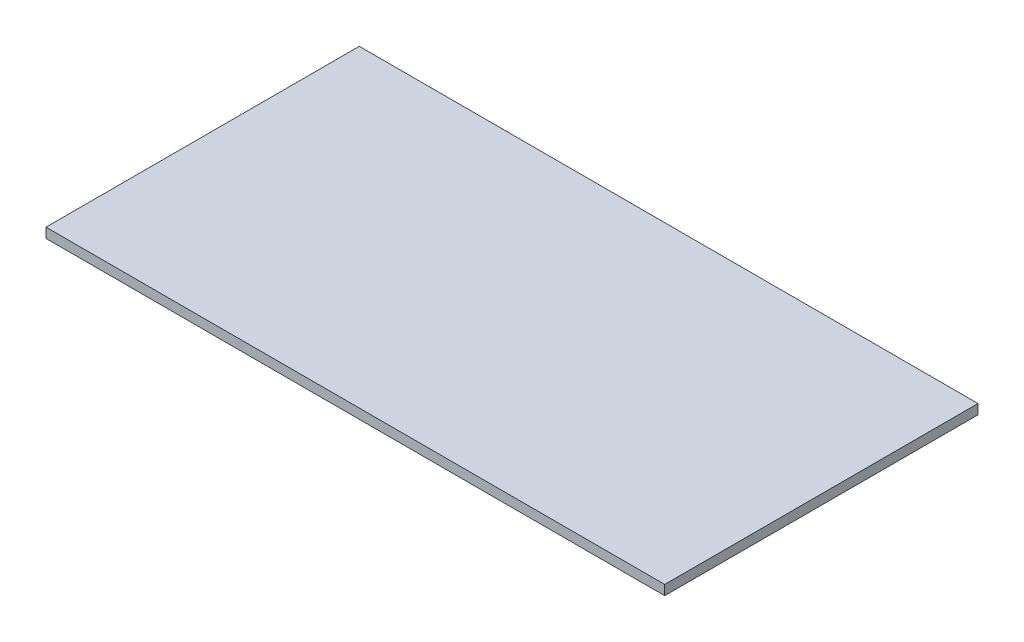
ISO-10303-21;
HEADER;
FILE_DESCRIPTION(('STEP AP214'),'2;1');
FILE_NAME('part.step','',(''),(''),'','','');
FILE_SCHEMA(('AUTOMOTIVE_DESIGN { 1 0 10303 214 1 1 1 1 }'));
ENDSEC;
DATA;
#1=APPLICATION_CONTEXT('core data for automotive mechanical design processes');
#2=APPLICATION_PROTOCOL_DEFINITION('international standard','automotive_design',2000,#1);
#3=PRODUCT_CONTEXT('',#1,'mechanical');
#4=PRODUCT('Part','Part','',(#3));
#5=PRODUCT_RELATED_PRODUCT_CATEGORY('part','',(#4));
#6=PRODUCT_DEFINITION_FORMATION('','',#4);
#7=PRODUCT_DEFINITION_CONTEXT('part definition',#1,'design');
#8=PRODUCT_DEFINITION('design','',#6,#7);
#9=PRODUCT_DEFINITION_SHAPE('','',#8);
#10=(LENGTH_UNIT() NAMED_UNIT(*) SI_UNIT(.MILLI.,.METRE.));
#11=(NAMED_UNIT(*) PLANE_ANGLE_UNIT() SI_UNIT($,.RADIAN.));
#12=(NAMED_UNIT(*) SI_UNIT($,.STERADIAN.) SOLID_ANGLE_UNIT());
#13=UNCERTAINTY_MEASURE_WITH_UNIT(LENGTH_MEASURE(1.E-05),#10,'distance_accuracy_value','');
#14=(GEOMETRIC_REPRESENTATION_CONTEXT(3) GLOBAL_UNCERTAINTY_ASSIGNED_CONTEXT((#13)) GLOBAL_UNIT_ASSIGNED_CONTEXT((#10,
#11,#12)) REPRESENTATION_CONTEXT('',''));
#15=CARTESIAN_POINT('',(0.,0.,0.));
#16=DIRECTION('',(0.,0.,1.));
#17=DIRECTION('',(1.,0.,0.));
#18=AXIS2_PLACEMENT_3D('',#15,#16,#17);
#19=CARTESIAN_POINT('',(0.,3.175,-37.8257276995306));
#20=DIRECTION('',(1.,0.,0.));
#21=DIRECTION('',(0.,0.,-1.));
#22=AXIS2_PLACEMENT_3D('',#19,#20,#21);
#23=PLANE('',#22);
#24=DIRECTION('',(0.,0.,1.));
#25=VECTOR('',#24,1.);
#26=CARTESIAN_POINT('',(0.,0.,-37.8257276995306));
#27=LINE('',#26,#25);
#28=CARTESIAN_POINT('',(0.,0.,-139.425727699531));
#29=VERTEX_POINT('',#28);
#30=CARTESIAN_POINT('',(0.,0.,-37.8257276995306));
#31=VERTEX_POINT('',#30);
#32=EDGE_CURVE('E96',#29,#31,#27,.T.);
#33=ORIENTED_EDGE('',*,*,#32,.T.);
#34=DIRECTION('',(0.,-1.,0.));
#35=VECTOR('',#34,1.);
#36=CARTESIAN_POINT('',(0.,3.175,-37.8257276995306));
#37=LINE('',#36,#35);
#38=CARTESIAN_POINT('',(0.,3.175,-37.8257276995306));
#39=VERTEX_POINT('',#38);
#40=EDGE_CURVE('E11',#39,#31,#37,.T.);
#41=ORIENTED_EDGE('',*,*,#40,.F.);
#42=DIRECTION('',(0.,0.,1.));
#43=VECTOR('',#42,1.);
#44=CARTESIAN_POINT('',(0.,3.175,-37.8257276995306));
#45=LINE('',#44,#43);
#46=CARTESIAN_POINT('',(0.,3.175,-139.425727699531));
#47=VERTEX_POINT('',#46);
#48=EDGE_CURVE('E84',#47,#39,#45,.T.);
#49=ORIENTED_EDGE('',*,*,#48,.F.);
#50=DIRECTION('',(0.,-1.,0.));
#51=VECTOR('',#50,1.);
#52=CARTESIAN_POINT('',(0.,3.175,-139.425727699531));
#53=LINE('',#52,#51);
#54=EDGE_CURVE('E92',#47,#29,#53,.T.);
#55=ORIENTED_EDGE('',*,*,#54,.T.);
#56=EDGE_LOOP('',(#33,#41,#49,#55));
#57=FACE_BOUND('',#56,.T.);
#58=ADVANCED_FACE('F33',(#57),#23,.F.);
#59=CARTESIAN_POINT('',(0.,3.175,-37.8257276995306));
#60=DIRECTION('',(0.,0.,-1.));
#61=DIRECTION('',(-1.,0.,0.));
#62=AXIS2_PLACEMENT_3D('',#59,#60,#61);
#63=PLANE('',#62);
#64=DIRECTION('',(1.,0.,0.));
#65=VECTOR('',#64,1.);
#66=CARTESIAN_POINT('',(0.,0.,-37.8257276995306));
#67=LINE('',#66,#65);
#68=CARTESIAN_POINT('',(200.66,0.,-37.8257276995306));
#69=VERTEX_POINT('',#68);
#70=EDGE_CURVE('E88',#31,#69,#67,.T.);
#71=ORIENTED_EDGE('',*,*,#70,.T.);
#72=DIRECTION('',(0.,-1.,0.));
#73=VECTOR('',#72,1.);
#74=CARTESIAN_POINT('',(200.66,3.175,-37.8257276995306));
#75=LINE('',#74,#73);
#76=CARTESIAN_POINT('',(200.66,3.175,-37.8257276995306));
#77=VERTEX_POINT('',#76);
#78=EDGE_CURVE('E41',#77,#69,#75,.T.);
#79=ORIENTED_EDGE('',*,*,#78,.F.);
#80=DIRECTION('',(1.,0.,0.));
#81=VECTOR('',#80,1.);
#82=CARTESIAN_POINT('',(0.,3.175,-37.8257276995306));
#83=LINE('',#82,#81);
#84=EDGE_CURVE('E79',#39,#77,#83,.T.);
#85=ORIENTED_EDGE('',*,*,#84,.F.);
#86=ORIENTED_EDGE('',*,*,#40,.T.);
#87=EDGE_LOOP('',(#71,#79,#85,#86));
#88=FACE_BOUND('',#87,.T.);
#89=ADVANCED_FACE('F87',(#88),#63,.F.);
#90=CARTESIAN_POINT('',(200.66,3.175,-37.8257276995306));
#91=DIRECTION('',(-1.,0.,0.));
#92=DIRECTION('',(0.,0.,1.));
#93=AXIS2_PLACEMENT_3D('',#90,#91,#92);
#94=PLANE('',#93);
#95=DIRECTION('',(0.,0.,-1.));
#96=VECTOR('',#95,1.);
#97=CARTESIAN_POINT('',(200.66,0.,-37.8257276995306));
#98=LINE('',#97,#96);
#99=CARTESIAN_POINT('',(200.66,0.,-139.425727699531));
#100=VERTEX_POINT('',#99);
#101=EDGE_CURVE('E66',#69,#100,#98,.T.);
#102=ORIENTED_EDGE('',*,*,#101,.T.);
#103=DIRECTION('',(0.,-1.,0.));
#104=VECTOR('',#103,1.);
#105=CARTESIAN_POINT('',(200.66,3.175,-139.425727699531));
#106=LINE('',#105,#104);
#107=CARTESIAN_POINT('',(200.66,3.175,-139.425727699531));
#108=VERTEX_POINT('',#107);
#109=EDGE_CURVE('E89',#108,#100,#106,.T.);
#110=ORIENTED_EDGE('',*,*,#109,.F.);
#111=DIRECTION('',(0.,0.,-1.));
#112=VECTOR('',#111,1.);
#113=CARTESIAN_POINT('',(200.66,3.175,-37.8257276995306));
#114=LINE('',#113,#112);
#115=EDGE_CURVE('E82',#77,#108,#114,.T.);
#116=ORIENTED_EDGE('',*,*,#115,.F.);
#117=ORIENTED_EDGE('',*,*,#78,.T.);
#118=EDGE_LOOP('',(#102,#110,#116,#117));
#119=FACE_BOUND('',#118,.T.);
#120=ADVANCED_FACE('F90',(#119),#94,.F.);
#121=CARTESIAN_POINT('',(0.,3.175,-139.425727699531));
#122=DIRECTION('',(0.,0.,1.));
#123=DIRECTION('',(1.,0.,0.));
#124=AXIS2_PLACEMENT_3D('',#121,#122,#123);
#125=PLANE('',#124);
#126=DIRECTION('',(-1.,0.,0.));
#127=VECTOR('',#126,1.);
#128=CARTESIAN_POINT('',(0.,0.,-139.425727699531));
#129=LINE('',#128,#127);
#130=EDGE_CURVE('E72',#100,#29,#129,.T.);
#131=ORIENTED_EDGE('',*,*,#130,.T.);
#132=ORIENTED_EDGE('',*,*,#54,.F.);
#133=DIRECTION('',(-1.,0.,0.));
#134=VECTOR('',#133,1.);
#135=CARTESIAN_POINT('',(0.,3.175,-139.425727699531));
#136=LINE('',#135,#134);
#137=EDGE_CURVE('E49',#108,#47,#136,.T.);
#138=ORIENTED_EDGE('',*,*,#137,.F.);
#139=ORIENTED_EDGE('',*,*,#109,.T.);
#140=EDGE_LOOP('',(#131,#132,#138,#139));
#141=FACE_BOUND('',#140,.T.);
#142=ADVANCED_FACE('F103',(#141),#125,.F.);
#143=CARTESIAN_POINT('',(0.,3.175,0.));
#144=DIRECTION('',(0.,-1.,0.));
#145=DIRECTION('',(0.,0.,-1.));
#146=AXIS2_PLACEMENT_3D('',#143,#144,#145);
#147=PLANE('',#146);
#148=ORIENTED_EDGE('',*,*,#48,.T.);
#149=ORIENTED_EDGE('',*,*,#84,.T.);
#150=ORIENTED_EDGE('',*,*,#115,.T.);
#151=ORIENTED_EDGE('',*,*,#137,.T.);
#152=EDGE_LOOP('',(#148,#149,#150,#151));
#153=FACE_BOUND('',#152,.T.);
#154=ADVANCED_FACE('F80',(#153),#147,.F.);
#155=CARTESIAN_POINT('',(0.,0.,0.));
#156=DIRECTION('',(0.,-1.,0.));
#157=DIRECTION('',(0.,0.,-1.));
#158=AXIS2_PLACEMENT_3D('',#155,#156,#157);
#159=PLANE('',#158);
#160=ORIENTED_EDGE('',*,*,#32,.F.);
#161=ORIENTED_EDGE('',*,*,#130,.F.);
#162=ORIENTED_EDGE('',*,*,#101,.F.);
#163=ORIENTED_EDGE('',*,*,#70,.F.);
#164=EDGE_LOOP('',(#160,#161,#162,#163));
#165=FACE_BOUND('',#164,.T.);
#166=ADVANCED_FACE('F106',(#165),#159,.T.);
#167=CLOSED_SHELL('',(#58,#89,#120,#142,#154,#166));
#168=MANIFOLD_SOLID_BREP('B2',#167);
#169=ADVANCED_BREP_SHAPE_REPRESENTATION('',(#18,#168),#14);
#170=SHAPE_DEFINITION_REPRESENTATION(#9,#169);
ENDSEC;
END-ISO-10303-21;
